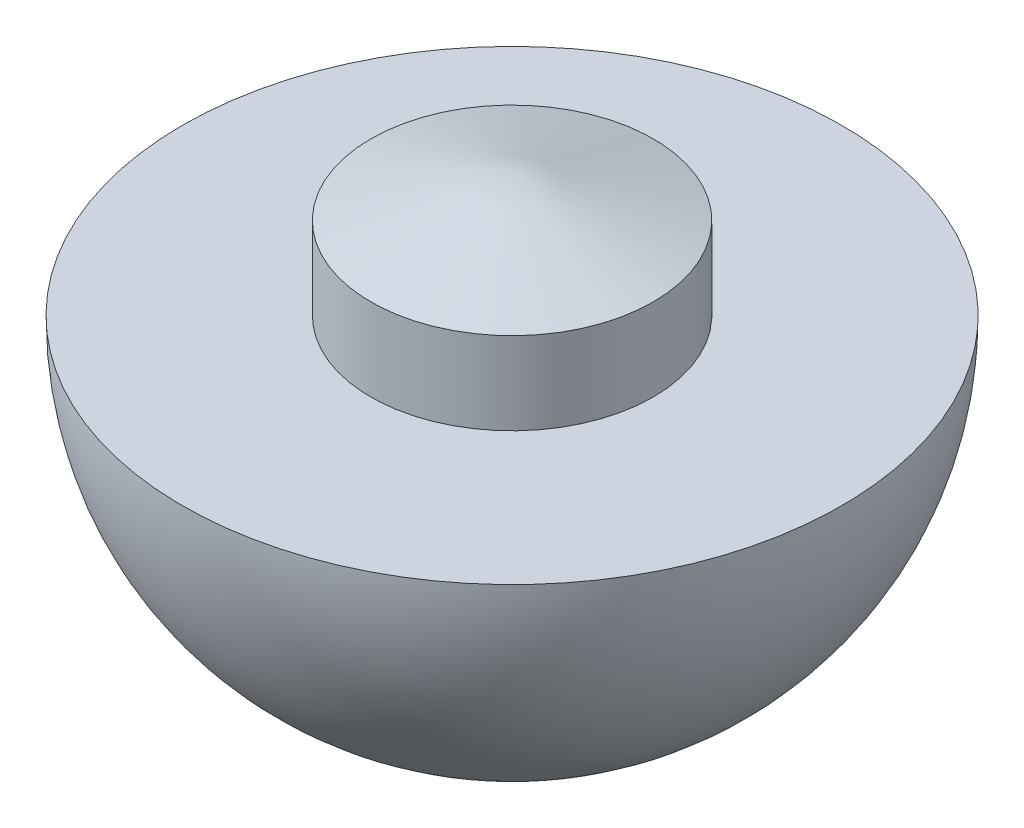
ISO-10303-21;
HEADER;
FILE_DESCRIPTION(('STEP AP214'),'2;1');
FILE_NAME('part.step','',(''),(''),'','','');
FILE_SCHEMA(('AUTOMOTIVE_DESIGN { 1 0 10303 214 1 1 1 1 }'));
ENDSEC;
DATA;
#1=APPLICATION_CONTEXT('core data for automotive mechanical design processes');
#2=APPLICATION_PROTOCOL_DEFINITION('international standard','automotive_design',2000,#1);
#3=PRODUCT_CONTEXT('',#1,'mechanical');
#4=PRODUCT('Part','Part','',(#3));
#5=PRODUCT_RELATED_PRODUCT_CATEGORY('part','',(#4));
#6=PRODUCT_DEFINITION_FORMATION('','',#4);
#7=PRODUCT_DEFINITION_CONTEXT('part definition',#1,'design');
#8=PRODUCT_DEFINITION('design','',#6,#7);
#9=PRODUCT_DEFINITION_SHAPE('','',#8);
#10=(LENGTH_UNIT() NAMED_UNIT(*) SI_UNIT(.MILLI.,.METRE.));
#11=(NAMED_UNIT(*) PLANE_ANGLE_UNIT() SI_UNIT($,.RADIAN.));
#12=(NAMED_UNIT(*) SI_UNIT($,.STERADIAN.) SOLID_ANGLE_UNIT());
#13=UNCERTAINTY_MEASURE_WITH_UNIT(LENGTH_MEASURE(1.E-05),#10,'distance_accuracy_value','');
#14=(GEOMETRIC_REPRESENTATION_CONTEXT(3) GLOBAL_UNCERTAINTY_ASSIGNED_CONTEXT((#13)) GLOBAL_UNIT_ASSIGNED_CONTEXT((#10,
#11,#12)) REPRESENTATION_CONTEXT('',''));
#15=CARTESIAN_POINT('',(0.,0.,0.));
#16=DIRECTION('',(0.,0.,1.));
#17=DIRECTION('',(1.,0.,0.));
#18=AXIS2_PLACEMENT_3D('',#15,#16,#17);
#19=CARTESIAN_POINT('',(1.778,2.4511,0.));
#20=DIRECTION('',(0.,-1.,0.));
#21=DIRECTION('',(1.,0.,0.));
#22=AXIS2_PLACEMENT_3D('',#19,#20,#21);
#23=CONICAL_SURFACE('',#22,0.,1.27933953231703);
#24=CARTESIAN_POINT('',(1.778,1.9939,0.));
#25=DIRECTION('',(0.,1.,0.));
#26=DIRECTION('',(-1.,0.,0.));
#27=AXIS2_PLACEMENT_3D('',#24,#25,#26);
#28=CIRCLE('',#27,1.524);
#29=CARTESIAN_POINT('',(0.254000000000002,1.9939,0.));
#30=VERTEX_POINT('',#29);
#31=EDGE_CURVE('E13',#30,#30,#28,.T.);
#32=ORIENTED_EDGE('',*,*,#31,.T.);
#33=EDGE_LOOP('',(#32));
#34=FACE_BOUND('',#33,.T.);
#35=CARTESIAN_POINT('',(1.778,2.4511,0.));
#36=VERTEX_POINT('',#35);
#37=VERTEX_LOOP('',#36);
#38=FACE_BOUND('',#37,.T.);
#39=ADVANCED_FACE('F42',(#34,#38),#23,.T.);
#40=CARTESIAN_POINT('',(1.778,2.4511,0.));
#41=DIRECTION('',(0.,1.,0.));
#42=DIRECTION('',(-1.,0.,0.));
#43=AXIS2_PLACEMENT_3D('',#40,#41,#42);
#44=CYLINDRICAL_SURFACE('',#43,1.524);
#45=CARTESIAN_POINT('',(1.778,1.10490000000001,0.));
#46=DIRECTION('',(0.,1.,0.));
#47=DIRECTION('',(-1.,0.,0.));
#48=AXIS2_PLACEMENT_3D('',#45,#46,#47);
#49=CIRCLE('',#48,1.524);
#50=CARTESIAN_POINT('',(0.254000000000002,1.10490000000001,0.));
#51=VERTEX_POINT('',#50);
#52=EDGE_CURVE('E48',#51,#51,#49,.T.);
#53=ORIENTED_EDGE('',*,*,#52,.T.);
#54=EDGE_LOOP('',(#53));
#55=FACE_BOUND('',#54,.T.);
#56=ORIENTED_EDGE('',*,*,#31,.F.);
#57=EDGE_LOOP('',(#56));
#58=FACE_BOUND('',#57,.T.);
#59=ADVANCED_FACE('F52',(#55,#58),#44,.T.);
#60=CARTESIAN_POINT('',(-1.778,1.10490000000001,0.));
#61=DIRECTION('',(0.,1.,0.));
#62=DIRECTION('',(-1.,0.,0.));
#63=AXIS2_PLACEMENT_3D('',#60,#61,#62);
#64=PLANE('',#63);
#65=CARTESIAN_POINT('',(1.778,1.10490000000001,0.));
#66=DIRECTION('',(0.,1.,0.));
#67=DIRECTION('',(-1.,0.,0.));
#68=AXIS2_PLACEMENT_3D('',#65,#66,#67);
#69=CIRCLE('',#68,3.556);
#70=CARTESIAN_POINT('',(-1.778,1.10490000000001,0.));
#71=VERTEX_POINT('',#70);
#72=EDGE_CURVE('E75',#71,#71,#69,.T.);
#73=ORIENTED_EDGE('',*,*,#72,.T.);
#74=EDGE_LOOP('',(#73));
#75=FACE_BOUND('',#74,.T.);
#76=ORIENTED_EDGE('',*,*,#52,.F.);
#77=EDGE_LOOP('',(#76));
#78=FACE_BOUND('',#77,.T.);
#79=ADVANCED_FACE('F57',(#75,#78),#64,.T.);
#80=CARTESIAN_POINT('',(1.778,1.10490000000001,0.));
#81=DIRECTION('',(0.,1.,0.));
#82=DIRECTION('',(-1.,0.,0.));
#83=AXIS2_PLACEMENT_3D('',#80,#81,#82);
#84=SPHERICAL_SURFACE('',#83,3.556);
#85=ORIENTED_EDGE('',*,*,#72,.F.);
#86=EDGE_LOOP('',(#85));
#87=FACE_BOUND('',#86,.T.);
#88=ADVANCED_FACE('F64',(#87),#84,.T.);
#89=CLOSED_SHELL('',(#39,#59,#79,#88));
#90=MANIFOLD_SOLID_BREP('B2',#89);
#91=ADVANCED_BREP_SHAPE_REPRESENTATION('',(#18,#90),#14);
#92=SHAPE_DEFINITION_REPRESENTATION(#9,#91);
ENDSEC;
END-ISO-10303-21;
